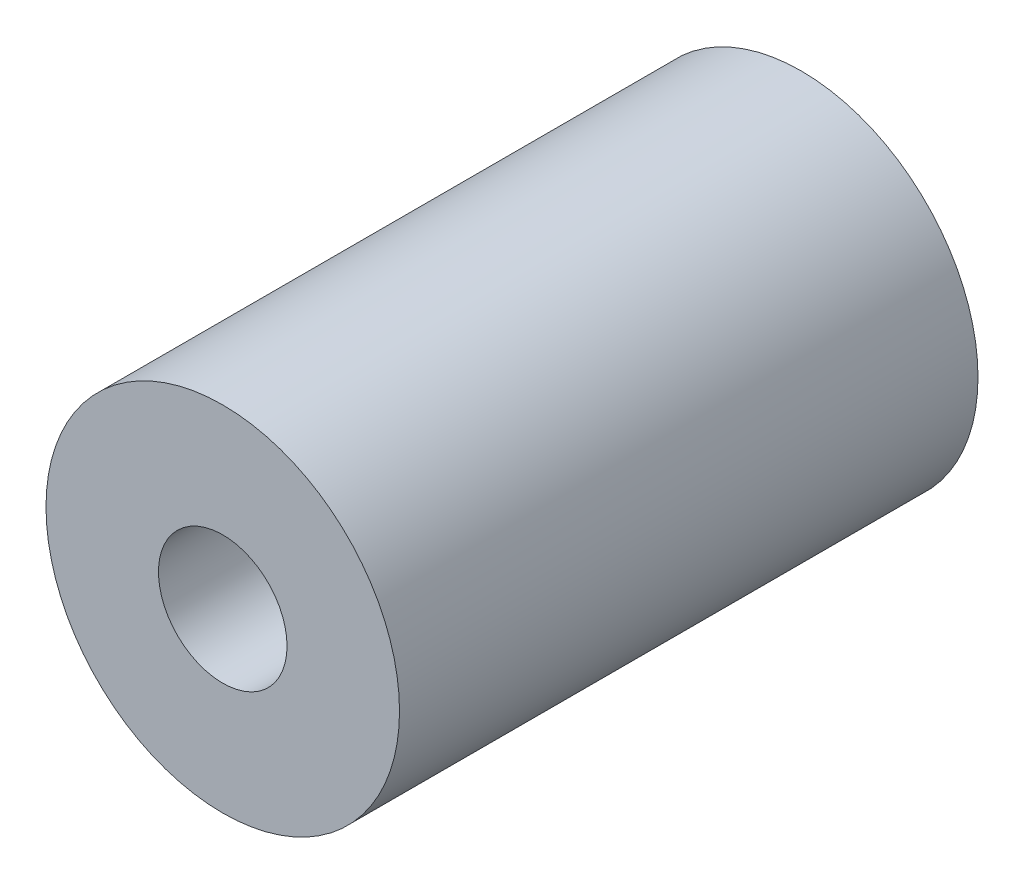
ISO-10303-21;
HEADER;
FILE_DESCRIPTION(('STEP AP214'),'2;1');
FILE_NAME('part.step','',(''),(''),'','','');
FILE_SCHEMA(('AUTOMOTIVE_DESIGN { 1 0 10303 214 1 1 1 1 }'));
ENDSEC;
DATA;
#1=APPLICATION_CONTEXT('core data for automotive mechanical design processes');
#2=APPLICATION_PROTOCOL_DEFINITION('international standard','automotive_design',2000,#1);
#3=PRODUCT_CONTEXT('',#1,'mechanical');
#4=PRODUCT('Part','Part','',(#3));
#5=PRODUCT_RELATED_PRODUCT_CATEGORY('part','',(#4));
#6=PRODUCT_DEFINITION_FORMATION('','',#4);
#7=PRODUCT_DEFINITION_CONTEXT('part definition',#1,'design');
#8=PRODUCT_DEFINITION('design','',#6,#7);
#9=PRODUCT_DEFINITION_SHAPE('','',#8);
#10=(LENGTH_UNIT() NAMED_UNIT(*) SI_UNIT(.MILLI.,.METRE.));
#11=(NAMED_UNIT(*) PLANE_ANGLE_UNIT() SI_UNIT($,.RADIAN.));
#12=(NAMED_UNIT(*) SI_UNIT($,.STERADIAN.) SOLID_ANGLE_UNIT());
#13=UNCERTAINTY_MEASURE_WITH_UNIT(LENGTH_MEASURE(1.E-05),#10,'distance_accuracy_value','');
#14=(GEOMETRIC_REPRESENTATION_CONTEXT(3) GLOBAL_UNCERTAINTY_ASSIGNED_CONTEXT((#13)) GLOBAL_UNIT_ASSIGNED_CONTEXT((#10,
#11,#12)) REPRESENTATION_CONTEXT('',''));
#15=CARTESIAN_POINT('',(0.,0.,0.));
#16=DIRECTION('',(0.,0.,1.));
#17=DIRECTION('',(1.,0.,0.));
#18=AXIS2_PLACEMENT_3D('',#15,#16,#17);
#19=CARTESIAN_POINT('',(0.,0.,36.));
#20=DIRECTION('',(0.,0.,1.));
#21=DIRECTION('',(1.,0.,0.));
#22=AXIS2_PLACEMENT_3D('',#19,#20,#21);
#23=PLANE('',#22);
#24=CARTESIAN_POINT('',(0.,0.,36.));
#25=DIRECTION('',(0.,0.,1.));
#26=DIRECTION('',(1.,0.,0.));
#27=AXIS2_PLACEMENT_3D('',#24,#25,#26);
#28=CIRCLE('',#27,11.);
#29=CARTESIAN_POINT('',(11.,0.,36.));
#30=VERTEX_POINT('',#29);
#31=EDGE_CURVE('E10',#30,#30,#28,.T.);
#32=ORIENTED_EDGE('',*,*,#31,.T.);
#33=EDGE_LOOP('',(#32));
#34=FACE_BOUND('',#33,.T.);
#35=CARTESIAN_POINT('',(0.,0.,36.));
#36=DIRECTION('',(0.,0.,1.));
#37=DIRECTION('',(1.,0.,0.));
#38=AXIS2_PLACEMENT_3D('',#35,#36,#37);
#39=CIRCLE('',#38,4.);
#40=CARTESIAN_POINT('',(4.,0.,36.));
#41=VERTEX_POINT('',#40);
#42=EDGE_CURVE('E42',#41,#41,#39,.T.);
#43=ORIENTED_EDGE('',*,*,#42,.F.);
#44=EDGE_LOOP('',(#43));
#45=FACE_BOUND('',#44,.T.);
#46=ADVANCED_FACE('F31',(#34,#45),#23,.T.);
#47=CARTESIAN_POINT('',(0.,0.,0.));
#48=DIRECTION('',(0.,0.,1.));
#49=DIRECTION('',(1.,0.,0.));
#50=AXIS2_PLACEMENT_3D('',#47,#48,#49);
#51=PLANE('',#50);
#52=CARTESIAN_POINT('',(0.,0.,0.));
#53=DIRECTION('',(0.,0.,1.));
#54=DIRECTION('',(1.,0.,0.));
#55=AXIS2_PLACEMENT_3D('',#52,#53,#54);
#56=CIRCLE('',#55,11.);
#57=CARTESIAN_POINT('',(11.,0.,0.));
#58=VERTEX_POINT('',#57);
#59=EDGE_CURVE('E35',#58,#58,#56,.T.);
#60=ORIENTED_EDGE('',*,*,#59,.F.);
#61=EDGE_LOOP('',(#60));
#62=FACE_BOUND('',#61,.T.);
#63=CARTESIAN_POINT('',(0.,0.,0.));
#64=DIRECTION('',(0.,0.,1.));
#65=DIRECTION('',(1.,0.,0.));
#66=AXIS2_PLACEMENT_3D('',#63,#64,#65);
#67=CIRCLE('',#66,4.);
#68=CARTESIAN_POINT('',(4.,0.,0.));
#69=VERTEX_POINT('',#68);
#70=EDGE_CURVE('E44',#69,#69,#67,.T.);
#71=ORIENTED_EDGE('',*,*,#70,.T.);
#72=EDGE_LOOP('',(#71));
#73=FACE_BOUND('',#72,.T.);
#74=ADVANCED_FACE('F54',(#62,#73),#51,.F.);
#75=CARTESIAN_POINT('',(0.,0.,36.));
#76=DIRECTION('',(0.,0.,-1.));
#77=DIRECTION('',(-1.,0.,0.));
#78=AXIS2_PLACEMENT_3D('',#75,#76,#77);
#79=CYLINDRICAL_SURFACE('',#78,11.);
#80=ORIENTED_EDGE('',*,*,#31,.F.);
#81=EDGE_LOOP('',(#80));
#82=FACE_BOUND('',#81,.T.);
#83=ORIENTED_EDGE('',*,*,#59,.T.);
#84=EDGE_LOOP('',(#83));
#85=FACE_BOUND('',#84,.T.);
#86=ADVANCED_FACE('F33',(#82,#85),#79,.T.);
#87=CARTESIAN_POINT('',(0.,0.,36.));
#88=DIRECTION('',(0.,0.,-1.));
#89=DIRECTION('',(-1.,0.,0.));
#90=AXIS2_PLACEMENT_3D('',#87,#88,#89);
#91=CYLINDRICAL_SURFACE('',#90,4.);
#92=ORIENTED_EDGE('',*,*,#42,.T.);
#93=EDGE_LOOP('',(#92));
#94=FACE_BOUND('',#93,.T.);
#95=ORIENTED_EDGE('',*,*,#70,.F.);
#96=EDGE_LOOP('',(#95));
#97=FACE_BOUND('',#96,.T.);
#98=ADVANCED_FACE('F50',(#94,#97),#91,.F.);
#99=CLOSED_SHELL('',(#46,#74,#86,#98));
#100=MANIFOLD_SOLID_BREP('B2',#99);
#101=ADVANCED_BREP_SHAPE_REPRESENTATION('',(#18,#100),#14);
#102=SHAPE_DEFINITION_REPRESENTATION(#9,#101);
ENDSEC;
END-ISO-10303-21;
